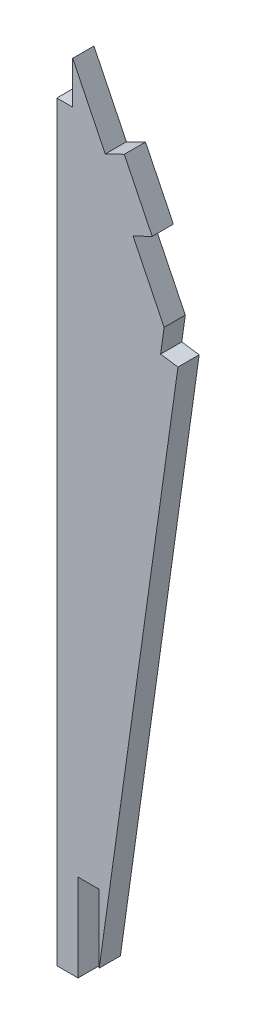
ISO-10303-21;
HEADER;
FILE_DESCRIPTION(('STEP AP214'),'2;1');
FILE_NAME('part.step','',(''),(''),'','','');
FILE_SCHEMA(('AUTOMOTIVE_DESIGN { 1 0 10303 214 1 1 1 1 }'));
ENDSEC;
DATA;
#1=APPLICATION_CONTEXT('core data for automotive mechanical design processes');
#2=APPLICATION_PROTOCOL_DEFINITION('international standard','automotive_design',2000,#1);
#3=PRODUCT_CONTEXT('',#1,'mechanical');
#4=PRODUCT('Part','Part','',(#3));
#5=PRODUCT_RELATED_PRODUCT_CATEGORY('part','',(#4));
#6=PRODUCT_DEFINITION_FORMATION('','',#4);
#7=PRODUCT_DEFINITION_CONTEXT('part definition',#1,'design');
#8=PRODUCT_DEFINITION('design','',#6,#7);
#9=PRODUCT_DEFINITION_SHAPE('','',#8);
#10=(LENGTH_UNIT() NAMED_UNIT(*) SI_UNIT(.MILLI.,.METRE.));
#11=(NAMED_UNIT(*) PLANE_ANGLE_UNIT() SI_UNIT($,.RADIAN.));
#12=(NAMED_UNIT(*) SI_UNIT($,.STERADIAN.) SOLID_ANGLE_UNIT());
#13=UNCERTAINTY_MEASURE_WITH_UNIT(LENGTH_MEASURE(1.E-05),#10,'distance_accuracy_value','');
#14=(GEOMETRIC_REPRESENTATION_CONTEXT(3) GLOBAL_UNCERTAINTY_ASSIGNED_CONTEXT((#13)) GLOBAL_UNIT_ASSIGNED_CONTEXT((#10,
#11,#12)) REPRESENTATION_CONTEXT('',''));
#15=CARTESIAN_POINT('',(0.,0.,0.));
#16=DIRECTION('',(0.,0.,1.));
#17=DIRECTION('',(1.,0.,0.));
#18=AXIS2_PLACEMENT_3D('',#15,#16,#17);
#19=CARTESIAN_POINT('',(6.17305665492677,80.7430384671234,2.));
#20=DIRECTION('',(-0.898794046299136,-0.43837114678914,0.));
#21=DIRECTION('',(0.43837114678914,-0.898794046299136,0.));
#22=AXIS2_PLACEMENT_3D('',#19,#20,#21);
#23=PLANE('',#22);
#24=DIRECTION('',(-0.43837114678914,0.898794046299136,0.));
#25=VECTOR('',#24,1.);
#26=CARTESIAN_POINT('',(6.17305665492677,80.7430384671234,0.));
#27=LINE('',#26,#25);
#28=CARTESIAN_POINT('',(9.24165468245155,74.4514801430278,0.));
#29=VERTEX_POINT('',#28);
#30=CARTESIAN_POINT('',(6.17305665492677,80.7430384671234,0.));
#31=VERTEX_POINT('',#30);
#32=EDGE_CURVE('E174',#29,#31,#27,.T.);
#33=ORIENTED_EDGE('',*,*,#32,.T.);
#34=DIRECTION('',(0.,0.,-1.));
#35=VECTOR('',#34,1.);
#36=CARTESIAN_POINT('',(6.17305665492677,80.7430384671234,2.));
#37=LINE('',#36,#35);
#38=CARTESIAN_POINT('',(6.17305665492677,80.7430384671234,2.));
#39=VERTEX_POINT('',#38);
#40=EDGE_CURVE('E11',#39,#31,#37,.T.);
#41=ORIENTED_EDGE('',*,*,#40,.F.);
#42=DIRECTION('',(-0.43837114678914,0.898794046299136,0.));
#43=VECTOR('',#42,1.);
#44=CARTESIAN_POINT('',(6.17305665492677,80.7430384671234,2.));
#45=LINE('',#44,#43);
#46=CARTESIAN_POINT('',(9.24165468245155,74.4514801430278,2.));
#47=VERTEX_POINT('',#46);
#48=EDGE_CURVE('E202',#47,#39,#45,.T.);
#49=ORIENTED_EDGE('',*,*,#48,.F.);
#50=DIRECTION('',(0.,0.,-1.));
#51=VECTOR('',#50,1.);
#52=CARTESIAN_POINT('',(9.24165468245155,74.4514801430278,2.));
#53=LINE('',#52,#51);
#54=EDGE_CURVE('E170',#47,#29,#53,.T.);
#55=ORIENTED_EDGE('',*,*,#54,.T.);
#56=EDGE_LOOP('',(#33,#41,#49,#55));
#57=FACE_BOUND('',#56,.T.);
#58=ADVANCED_FACE('F36',(#57),#23,.F.);
#59=CARTESIAN_POINT('',(6.17305665492677,80.7430384671234,2.));
#60=DIRECTION('',(1.,2.27465615787485E-13,0.));
#61=DIRECTION('',(-2.27465615787485E-13,1.,0.));
#62=AXIS2_PLACEMENT_3D('',#59,#60,#61);
#63=PLANE('',#62);
#64=DIRECTION('',(2.27465615787485E-13,-1.,0.));
#65=VECTOR('',#64,1.);
#66=CARTESIAN_POINT('',(6.17305665492677,80.7430384671234,0.));
#67=LINE('',#66,#65);
#68=CARTESIAN_POINT('',(6.17305665492768,76.7430384671238,0.));
#69=VERTEX_POINT('',#68);
#70=EDGE_CURVE('E177',#31,#69,#67,.T.);
#71=ORIENTED_EDGE('',*,*,#70,.T.);
#72=DIRECTION('',(0.,0.,-1.));
#73=VECTOR('',#72,1.);
#74=CARTESIAN_POINT('',(6.17305665492768,76.7430384671238,2.));
#75=LINE('',#74,#73);
#76=CARTESIAN_POINT('',(6.17305665492768,76.7430384671238,2.));
#77=VERTEX_POINT('',#76);
#78=EDGE_CURVE('E44',#77,#69,#75,.T.);
#79=ORIENTED_EDGE('',*,*,#78,.F.);
#80=DIRECTION('',(2.27465615787485E-13,-1.,0.));
#81=VECTOR('',#80,1.);
#82=CARTESIAN_POINT('',(6.17305665492677,80.7430384671234,2.));
#83=LINE('',#82,#81);
#84=EDGE_CURVE('E116',#39,#77,#83,.T.);
#85=ORIENTED_EDGE('',*,*,#84,.F.);
#86=ORIENTED_EDGE('',*,*,#40,.T.);
#87=EDGE_LOOP('',(#71,#79,#85,#86));
#88=FACE_BOUND('',#87,.T.);
#89=ADVANCED_FACE('F295',(#88),#63,.F.);
#90=CARTESIAN_POINT('',(6.17305665492768,76.7430384671238,2.));
#91=DIRECTION('',(0.,-1.,0.));
#92=DIRECTION('',(0.,0.,-1.));
#93=AXIS2_PLACEMENT_3D('',#90,#91,#92);
#94=PLANE('',#93);
#95=DIRECTION('',(-1.,0.,0.));
#96=VECTOR('',#95,1.);
#97=CARTESIAN_POINT('',(6.17305665492768,76.7430384671238,0.));
#98=LINE('',#97,#96);
#99=CARTESIAN_POINT('',(4.67305665492768,76.7430384671238,0.));
#100=VERTEX_POINT('',#99);
#101=EDGE_CURVE('E179',#69,#100,#98,.T.);
#102=ORIENTED_EDGE('',*,*,#101,.T.);
#103=DIRECTION('',(0.,0.,-1.));
#104=VECTOR('',#103,1.);
#105=CARTESIAN_POINT('',(4.67305665492768,76.7430384671238,2.));
#106=LINE('',#105,#104);
#107=CARTESIAN_POINT('',(4.67305665492768,76.7430384671238,2.));
#108=VERTEX_POINT('',#107);
#109=EDGE_CURVE('E230',#108,#100,#106,.T.);
#110=ORIENTED_EDGE('',*,*,#109,.F.);
#111=DIRECTION('',(-1.,0.,0.));
#112=VECTOR('',#111,1.);
#113=CARTESIAN_POINT('',(6.17305665492768,76.7430384671238,2.));
#114=LINE('',#113,#112);
#115=EDGE_CURVE('E238',#77,#108,#114,.T.);
#116=ORIENTED_EDGE('',*,*,#115,.F.);
#117=ORIENTED_EDGE('',*,*,#78,.T.);
#118=EDGE_LOOP('',(#102,#110,#116,#117));
#119=FACE_BOUND('',#118,.T.);
#120=ADVANCED_FACE('F236',(#119),#94,.F.);
#121=CARTESIAN_POINT('',(4.67305665492768,76.7430384671238,2.));
#122=DIRECTION('',(1.,0.,0.));
#123=DIRECTION('',(0.,1.,0.));
#124=AXIS2_PLACEMENT_3D('',#121,#122,#123);
#125=PLANE('',#124);
#126=DIRECTION('',(0.,-1.,0.));
#127=VECTOR('',#126,1.);
#128=CARTESIAN_POINT('',(4.67305665492768,76.7430384671238,0.));
#129=LINE('',#128,#127);
#130=CARTESIAN_POINT('',(4.67305665492677,5.83506006179459,0.));
#131=VERTEX_POINT('',#130);
#132=EDGE_CURVE('E181',#100,#131,#129,.T.);
#133=ORIENTED_EDGE('',*,*,#132,.T.);
#134=DIRECTION('',(0.,0.,-1.));
#135=VECTOR('',#134,1.);
#136=CARTESIAN_POINT('',(4.67305665492677,5.83506006179459,2.));
#137=LINE('',#136,#135);
#138=CARTESIAN_POINT('',(4.67305665492677,5.83506006179459,2.));
#139=VERTEX_POINT('',#138);
#140=EDGE_CURVE('E227',#139,#131,#137,.T.);
#141=ORIENTED_EDGE('',*,*,#140,.F.);
#142=DIRECTION('',(0.,-1.,0.));
#143=VECTOR('',#142,1.);
#144=CARTESIAN_POINT('',(4.67305665492768,76.7430384671238,2.));
#145=LINE('',#144,#143);
#146=EDGE_CURVE('E256',#108,#139,#145,.T.);
#147=ORIENTED_EDGE('',*,*,#146,.F.);
#148=ORIENTED_EDGE('',*,*,#109,.T.);
#149=EDGE_LOOP('',(#133,#141,#147,#148));
#150=FACE_BOUND('',#149,.T.);
#151=ADVANCED_FACE('F247',(#150),#125,.F.);
#152=CARTESIAN_POINT('',(4.67305665492677,5.83506006179459,2.));
#153=DIRECTION('',(0.,1.,0.));
#154=DIRECTION('',(0.,0.,1.));
#155=AXIS2_PLACEMENT_3D('',#152,#153,#154);
#156=PLANE('',#155);
#157=DIRECTION('',(1.,0.,0.));
#158=VECTOR('',#157,1.);
#159=CARTESIAN_POINT('',(4.67305665492677,5.83506006179459,0.));
#160=LINE('',#159,#158);
#161=CARTESIAN_POINT('',(6.67305665492677,5.83506006179459,0.));
#162=VERTEX_POINT('',#161);
#163=EDGE_CURVE('E183',#131,#162,#160,.T.);
#164=ORIENTED_EDGE('',*,*,#163,.T.);
#165=DIRECTION('',(0.,0.,-1.));
#166=VECTOR('',#165,1.);
#167=CARTESIAN_POINT('',(6.67305665492677,5.83506006179459,2.));
#168=LINE('',#167,#166);
#169=CARTESIAN_POINT('',(6.67305665492677,5.83506006179459,2.));
#170=VERTEX_POINT('',#169);
#171=EDGE_CURVE('E224',#170,#162,#168,.T.);
#172=ORIENTED_EDGE('',*,*,#171,.F.);
#173=DIRECTION('',(1.,0.,0.));
#174=VECTOR('',#173,1.);
#175=CARTESIAN_POINT('',(4.67305665492677,5.83506006179459,2.));
#176=LINE('',#175,#174);
#177=EDGE_CURVE('E253',#139,#170,#176,.T.);
#178=ORIENTED_EDGE('',*,*,#177,.F.);
#179=ORIENTED_EDGE('',*,*,#140,.T.);
#180=EDGE_LOOP('',(#164,#172,#178,#179));
#181=FACE_BOUND('',#180,.T.);
#182=ADVANCED_FACE('F251',(#181),#156,.F.);
#183=CARTESIAN_POINT('',(6.67305665492677,5.83506006179459,2.));
#184=DIRECTION('',(-1.,0.,0.));
#185=DIRECTION('',(0.,0.,1.));
#186=AXIS2_PLACEMENT_3D('',#183,#184,#185);
#187=PLANE('',#186);
#188=DIRECTION('',(0.,1.,0.));
#189=VECTOR('',#188,1.);
#190=CARTESIAN_POINT('',(6.67305665492677,5.83506006179459,0.));
#191=LINE('',#190,#189);
#192=CARTESIAN_POINT('',(6.67305665492677,14.0850600617946,0.));
#193=VERTEX_POINT('',#192);
#194=EDGE_CURVE('E185',#162,#193,#191,.T.);
#195=ORIENTED_EDGE('',*,*,#194,.T.);
#196=DIRECTION('',(0.,0.,-1.));
#197=VECTOR('',#196,1.);
#198=CARTESIAN_POINT('',(6.67305665492677,14.0850600617946,2.));
#199=LINE('',#198,#197);
#200=CARTESIAN_POINT('',(6.67305665492677,14.0850600617946,2.));
#201=VERTEX_POINT('',#200);
#202=EDGE_CURVE('E221',#201,#193,#199,.T.);
#203=ORIENTED_EDGE('',*,*,#202,.F.);
#204=DIRECTION('',(0.,1.,0.));
#205=VECTOR('',#204,1.);
#206=CARTESIAN_POINT('',(6.67305665492677,5.83506006179459,2.));
#207=LINE('',#206,#205);
#208=EDGE_CURVE('E255',#170,#201,#207,.T.);
#209=ORIENTED_EDGE('',*,*,#208,.F.);
#210=ORIENTED_EDGE('',*,*,#171,.T.);
#211=EDGE_LOOP('',(#195,#203,#209,#210));
#212=FACE_BOUND('',#211,.T.);
#213=ADVANCED_FACE('F308',(#212),#187,.F.);
#214=CARTESIAN_POINT('',(6.67305665492677,14.0850600617946,2.));
#215=DIRECTION('',(0.,1.,0.));
#216=DIRECTION('',(0.,0.,1.));
#217=AXIS2_PLACEMENT_3D('',#214,#215,#216);
#218=PLANE('',#217);
#219=DIRECTION('',(1.,0.,0.));
#220=VECTOR('',#219,1.);
#221=CARTESIAN_POINT('',(6.67305665492677,14.0850600617946,0.));
#222=LINE('',#221,#220);
#223=CARTESIAN_POINT('',(8.67305665492677,14.0850600617946,0.));
#224=VERTEX_POINT('',#223);
#225=EDGE_CURVE('E187',#193,#224,#222,.T.);
#226=ORIENTED_EDGE('',*,*,#225,.T.);
#227=DIRECTION('',(0.,0.,-1.));
#228=VECTOR('',#227,1.);
#229=CARTESIAN_POINT('',(8.67305665492677,14.0850600617946,2.));
#230=LINE('',#229,#228);
#231=CARTESIAN_POINT('',(8.67305665492677,14.0850600617946,2.));
#232=VERTEX_POINT('',#231);
#233=EDGE_CURVE('E218',#232,#224,#230,.T.);
#234=ORIENTED_EDGE('',*,*,#233,.F.);
#235=DIRECTION('',(1.,0.,0.));
#236=VECTOR('',#235,1.);
#237=CARTESIAN_POINT('',(6.67305665492677,14.0850600617946,2.));
#238=LINE('',#237,#236);
#239=EDGE_CURVE('E258',#201,#232,#238,.T.);
#240=ORIENTED_EDGE('',*,*,#239,.F.);
#241=ORIENTED_EDGE('',*,*,#202,.T.);
#242=EDGE_LOOP('',(#226,#234,#240,#241));
#243=FACE_BOUND('',#242,.T.);
#244=ADVANCED_FACE('F311',(#243),#218,.F.);
#245=CARTESIAN_POINT('',(8.67305665492677,14.0850600617946,2.));
#246=DIRECTION('',(1.,0.,0.));
#247=DIRECTION('',(0.,0.,-1.));
#248=AXIS2_PLACEMENT_3D('',#245,#246,#247);
#249=PLANE('',#248);
#250=DIRECTION('',(0.,-1.,0.));
#251=VECTOR('',#250,1.);
#252=CARTESIAN_POINT('',(8.67305665492677,14.0850600617946,0.));
#253=LINE('',#252,#251);
#254=CARTESIAN_POINT('',(8.67305665492677,7.64042759616723,0.));
#255=VERTEX_POINT('',#254);
#256=EDGE_CURVE('E189',#224,#255,#253,.T.);
#257=ORIENTED_EDGE('',*,*,#256,.T.);
#258=DIRECTION('',(0.,0.,-1.));
#259=VECTOR('',#258,1.);
#260=CARTESIAN_POINT('',(8.67305665492677,7.64042759616723,2.));
#261=LINE('',#260,#259);
#262=CARTESIAN_POINT('',(8.67305665492677,7.64042759616723,2.));
#263=VERTEX_POINT('',#262);
#264=EDGE_CURVE('E215',#263,#255,#261,.T.);
#265=ORIENTED_EDGE('',*,*,#264,.F.);
#266=DIRECTION('',(0.,-1.,0.));
#267=VECTOR('',#266,1.);
#268=CARTESIAN_POINT('',(8.67305665492677,14.0850600617946,2.));
#269=LINE('',#268,#267);
#270=EDGE_CURVE('E264',#232,#263,#269,.T.);
#271=ORIENTED_EDGE('',*,*,#270,.F.);
#272=ORIENTED_EDGE('',*,*,#233,.T.);
#273=EDGE_LOOP('',(#257,#265,#271,#272));
#274=FACE_BOUND('',#273,.T.);
#275=ADVANCED_FACE('F315',(#274),#249,.F.);
#276=CARTESIAN_POINT('',(8.67305665492677,7.64042759616723,2.));
#277=DIRECTION('',(-0.990252961763888,0.139280550393255,0.));
#278=DIRECTION('',(-0.139280550393255,-0.990252961763888,0.));
#279=AXIS2_PLACEMENT_3D('',#276,#277,#278);
#280=PLANE('',#279);
#281=DIRECTION('',(0.139280550393255,0.990252961763888,0.));
#282=VECTOR('',#281,1.);
#283=CARTESIAN_POINT('',(8.67305665492677,7.64042759616723,0.));
#284=LINE('',#283,#282);
#285=CARTESIAN_POINT('',(16.104503768187,60.4763224380504,0.));
#286=VERTEX_POINT('',#285);
#287=EDGE_CURVE('E191',#255,#286,#284,.T.);
#288=ORIENTED_EDGE('',*,*,#287,.T.);
#289=DIRECTION('',(0.,0.,-1.));
#290=VECTOR('',#289,1.);
#291=CARTESIAN_POINT('',(16.104503768187,60.4763224380504,2.));
#292=LINE('',#291,#290);
#293=CARTESIAN_POINT('',(16.104503768187,60.4763224380504,2.));
#294=VERTEX_POINT('',#293);
#295=EDGE_CURVE('E212',#294,#286,#292,.T.);
#296=ORIENTED_EDGE('',*,*,#295,.F.);
#297=DIRECTION('',(0.139280550393255,0.990252961763888,0.));
#298=VECTOR('',#297,1.);
#299=CARTESIAN_POINT('',(8.67305665492677,7.64042759616723,2.));
#300=LINE('',#299,#298);
#301=EDGE_CURVE('E266',#263,#294,#300,.T.);
#302=ORIENTED_EDGE('',*,*,#301,.F.);
#303=ORIENTED_EDGE('',*,*,#264,.T.);
#304=EDGE_LOOP('',(#288,#296,#302,#303));
#305=FACE_BOUND('',#304,.T.);
#306=ADVANCED_FACE('F319',(#305),#280,.F.);
#307=CARTESIAN_POINT('',(16.104503768187,60.4763224380504,2.));
#308=DIRECTION('',(-0.139460770441678,-0.99022759682197,0.));
#309=DIRECTION('',(0.99022759682197,-0.139460770441678,0.));
#310=AXIS2_PLACEMENT_3D('',#307,#308,#309);
#311=PLANE('',#310);
#312=DIRECTION('',(-0.99022759682197,0.139460770441678,0.));
#313=VECTOR('',#312,1.);
#314=CARTESIAN_POINT('',(16.104503768187,60.4763224380504,0.));
#315=LINE('',#314,#313);
#316=CARTESIAN_POINT('',(14.4629537900601,60.7075135555297,0.));
#317=VERTEX_POINT('',#316);
#318=EDGE_CURVE('E193',#286,#317,#315,.T.);
#319=ORIENTED_EDGE('',*,*,#318,.T.);
#320=DIRECTION('',(0.,0.,-1.));
#321=VECTOR('',#320,1.);
#322=CARTESIAN_POINT('',(14.4629537900601,60.7075135555297,2.));
#323=LINE('',#322,#321);
#324=CARTESIAN_POINT('',(14.4629537900601,60.7075135555297,2.));
#325=VERTEX_POINT('',#324);
#326=EDGE_CURVE('E209',#325,#317,#323,.T.);
#327=ORIENTED_EDGE('',*,*,#326,.F.);
#328=DIRECTION('',(-0.99022759682197,0.139460770441678,0.));
#329=VECTOR('',#328,1.);
#330=CARTESIAN_POINT('',(16.104503768187,60.4763224380504,2.));
#331=LINE('',#330,#329);
#332=EDGE_CURVE('E268',#294,#325,#331,.T.);
#333=ORIENTED_EDGE('',*,*,#332,.F.);
#334=ORIENTED_EDGE('',*,*,#295,.T.);
#335=EDGE_LOOP('',(#319,#327,#333,#334));
#336=FACE_BOUND('',#335,.T.);
#337=ADVANCED_FACE('F323',(#336),#311,.F.);
#338=CARTESIAN_POINT('',(14.4629537900601,60.7075135555297,2.));
#339=DIRECTION('',(-0.990227596822041,0.139460770441171,0.));
#340=DIRECTION('',(-0.139460770441171,-0.990227596822041,0.));
#341=AXIS2_PLACEMENT_3D('',#338,#339,#340);
#342=PLANE('',#341);
#343=DIRECTION('',(0.139460770441171,0.990227596822041,0.));
#344=VECTOR('',#343,1.);
#345=CARTESIAN_POINT('',(14.4629537900601,60.7075135555297,0.));
#346=LINE('',#345,#344);
#347=CARTESIAN_POINT('',(14.7950283721348,63.0653767333488,0.));
#348=VERTEX_POINT('',#347);
#349=EDGE_CURVE('E195',#317,#348,#346,.T.);
#350=ORIENTED_EDGE('',*,*,#349,.T.);
#351=DIRECTION('',(0.,0.,-1.));
#352=VECTOR('',#351,1.);
#353=CARTESIAN_POINT('',(14.7950283721348,63.0653767333488,2.));
#354=LINE('',#353,#352);
#355=CARTESIAN_POINT('',(14.7950283721348,63.0653767333488,2.));
#356=VERTEX_POINT('',#355);
#357=EDGE_CURVE('E206',#356,#348,#354,.T.);
#358=ORIENTED_EDGE('',*,*,#357,.F.);
#359=DIRECTION('',(0.139460770441171,0.990227596822041,0.));
#360=VECTOR('',#359,1.);
#361=CARTESIAN_POINT('',(14.4629537900601,60.7075135555297,2.));
#362=LINE('',#361,#360);
#363=EDGE_CURVE('E270',#325,#356,#362,.T.);
#364=ORIENTED_EDGE('',*,*,#363,.F.);
#365=ORIENTED_EDGE('',*,*,#326,.T.);
#366=EDGE_LOOP('',(#350,#358,#364,#365));
#367=FACE_BOUND('',#366,.T.);
#368=ADVANCED_FACE('F276',(#367),#342,.F.);
#369=CARTESIAN_POINT('',(11.8718815631864,69.0587158652324,2.));
#370=DIRECTION('',(-0.89879404629907,-0.438371146789276,0.));
#371=DIRECTION('',(0.438371146789276,-0.89879404629907,0.));
#372=AXIS2_PLACEMENT_3D('',#369,#370,#371);
#373=PLANE('',#372);
#374=DIRECTION('',(-0.438371146789276,0.89879404629907,0.));
#375=VECTOR('',#374,1.);
#376=CARTESIAN_POINT('',(11.8718815631864,69.0587158652324,0.));
#377=LINE('',#376,#375);
#378=CARTESIAN_POINT('',(11.8718815631864,69.0587158652324,0.));
#379=VERTEX_POINT('',#378);
#380=EDGE_CURVE('E197',#348,#379,#377,.T.);
#381=ORIENTED_EDGE('',*,*,#380,.T.);
#382=DIRECTION('',(0.,0.,-1.));
#383=VECTOR('',#382,1.);
#384=CARTESIAN_POINT('',(11.8718815631864,69.0587158652324,2.));
#385=LINE('',#384,#383);
#386=CARTESIAN_POINT('',(11.8718815631864,69.0587158652324,2.));
#387=VERTEX_POINT('',#386);
#388=EDGE_CURVE('E165',#387,#379,#385,.T.);
#389=ORIENTED_EDGE('',*,*,#388,.F.);
#390=DIRECTION('',(-0.438371146789276,0.89879404629907,0.));
#391=VECTOR('',#390,1.);
#392=CARTESIAN_POINT('',(11.8718815631864,69.0587158652324,2.));
#393=LINE('',#392,#391);
#394=EDGE_CURVE('E156',#356,#387,#393,.T.);
#395=ORIENTED_EDGE('',*,*,#394,.F.);
#396=ORIENTED_EDGE('',*,*,#357,.T.);
#397=EDGE_LOOP('',(#381,#389,#395,#396));
#398=FACE_BOUND('',#397,.T.);
#399=ADVANCED_FACE('F280',(#398),#373,.F.);
#400=CARTESIAN_POINT('',(13.6694696557852,69.9354581588104,2.));
#401=DIRECTION('',(-0.438371146788926,0.898794046299241,0.));
#402=DIRECTION('',(-0.898794046299241,-0.438371146788927,0.));
#403=AXIS2_PLACEMENT_3D('',#400,#401,#402);
#404=PLANE('',#403);
#405=DIRECTION('',(0.898794046299241,0.438371146788926,0.));
#406=VECTOR('',#405,1.);
#407=CARTESIAN_POINT('',(13.6694696557852,69.9354581588104,0.));
#408=LINE('',#407,#406);
#409=CARTESIAN_POINT('',(13.6694696557852,69.9354581588104,0.));
#410=VERTEX_POINT('',#409);
#411=EDGE_CURVE('E164',#379,#410,#408,.T.);
#412=ORIENTED_EDGE('',*,*,#411,.T.);
#413=DIRECTION('',(0.,0.,-1.));
#414=VECTOR('',#413,1.);
#415=CARTESIAN_POINT('',(13.6694696557852,69.9354581588104,2.));
#416=LINE('',#415,#414);
#417=CARTESIAN_POINT('',(13.6694696557852,69.9354581588104,2.));
#418=VERTEX_POINT('',#417);
#419=EDGE_CURVE('E161',#418,#410,#416,.T.);
#420=ORIENTED_EDGE('',*,*,#419,.F.);
#421=DIRECTION('',(0.898794046299241,0.438371146788926,0.));
#422=VECTOR('',#421,1.);
#423=CARTESIAN_POINT('',(13.6694696557852,69.9354581588104,2.));
#424=LINE('',#423,#422);
#425=EDGE_CURVE('E150',#387,#418,#424,.T.);
#426=ORIENTED_EDGE('',*,*,#425,.F.);
#427=ORIENTED_EDGE('',*,*,#388,.T.);
#428=EDGE_LOOP('',(#412,#420,#426,#427));
#429=FACE_BOUND('',#428,.T.);
#430=ADVANCED_FACE('F162',(#429),#404,.F.);
#431=CARTESIAN_POINT('',(11.0392427750503,75.3282224366058,2.));
#432=DIRECTION('',(-0.89879404629915,-0.438371146789112,0.));
#433=DIRECTION('',(0.438371146789112,-0.89879404629915,0.));
#434=AXIS2_PLACEMENT_3D('',#431,#432,#433);
#435=PLANE('',#434);
#436=DIRECTION('',(-0.438371146789112,0.89879404629915,0.));
#437=VECTOR('',#436,1.);
#438=CARTESIAN_POINT('',(11.0392427750503,75.3282224366058,0.));
#439=LINE('',#438,#437);
#440=CARTESIAN_POINT('',(11.0392427750503,75.3282224366058,0.));
#441=VERTEX_POINT('',#440);
#442=EDGE_CURVE('E102',#410,#441,#439,.T.);
#443=ORIENTED_EDGE('',*,*,#442,.T.);
#444=DIRECTION('',(0.,0.,-1.));
#445=VECTOR('',#444,1.);
#446=CARTESIAN_POINT('',(11.0392427750503,75.3282224366058,2.));
#447=LINE('',#446,#445);
#448=CARTESIAN_POINT('',(11.0392427750503,75.3282224366058,2.));
#449=VERTEX_POINT('',#448);
#450=EDGE_CURVE('E166',#449,#441,#447,.T.);
#451=ORIENTED_EDGE('',*,*,#450,.F.);
#452=DIRECTION('',(-0.438371146789112,0.89879404629915,0.));
#453=VECTOR('',#452,1.);
#454=CARTESIAN_POINT('',(11.0392427750503,75.3282224366058,2.));
#455=LINE('',#454,#453);
#456=EDGE_CURVE('E154',#418,#449,#455,.T.);
#457=ORIENTED_EDGE('',*,*,#456,.F.);
#458=ORIENTED_EDGE('',*,*,#419,.T.);
#459=EDGE_LOOP('',(#443,#451,#457,#458));
#460=FACE_BOUND('',#459,.T.);
#461=ADVANCED_FACE('F168',(#460),#435,.F.);
#462=CARTESIAN_POINT('',(9.24165468245155,74.4514801430278,2.));
#463=DIRECTION('',(0.438371146788926,-0.898794046299241,0.));
#464=DIRECTION('',(0.898794046299241,0.438371146788927,0.));
#465=AXIS2_PLACEMENT_3D('',#462,#463,#464);
#466=PLANE('',#465);
#467=DIRECTION('',(-0.898794046299241,-0.438371146788926,0.));
#468=VECTOR('',#467,1.);
#469=CARTESIAN_POINT('',(9.24165468245155,74.4514801430278,0.));
#470=LINE('',#469,#468);
#471=EDGE_CURVE('E108',#441,#29,#470,.T.);
#472=ORIENTED_EDGE('',*,*,#471,.T.);
#473=ORIENTED_EDGE('',*,*,#54,.F.);
#474=DIRECTION('',(-0.898794046299241,-0.438371146788926,0.));
#475=VECTOR('',#474,1.);
#476=CARTESIAN_POINT('',(9.24165468245155,74.4514801430278,2.));
#477=LINE('',#476,#475);
#478=EDGE_CURVE('E52',#449,#47,#477,.T.);
#479=ORIENTED_EDGE('',*,*,#478,.F.);
#480=ORIENTED_EDGE('',*,*,#450,.T.);
#481=EDGE_LOOP('',(#472,#473,#479,#480));
#482=FACE_BOUND('',#481,.T.);
#483=ADVANCED_FACE('F284',(#482),#466,.F.);
#484=CARTESIAN_POINT('',(0.,0.,2.));
#485=DIRECTION('',(0.,0.,1.));
#486=DIRECTION('',(1.,0.,0.));
#487=AXIS2_PLACEMENT_3D('',#484,#485,#486);
#488=PLANE('',#487);
#489=ORIENTED_EDGE('',*,*,#48,.T.);
#490=ORIENTED_EDGE('',*,*,#84,.T.);
#491=ORIENTED_EDGE('',*,*,#115,.T.);
#492=ORIENTED_EDGE('',*,*,#146,.T.);
#493=ORIENTED_EDGE('',*,*,#177,.T.);
#494=ORIENTED_EDGE('',*,*,#208,.T.);
#495=ORIENTED_EDGE('',*,*,#239,.T.);
#496=ORIENTED_EDGE('',*,*,#270,.T.);
#497=ORIENTED_EDGE('',*,*,#301,.T.);
#498=ORIENTED_EDGE('',*,*,#332,.T.);
#499=ORIENTED_EDGE('',*,*,#363,.T.);
#500=ORIENTED_EDGE('',*,*,#394,.T.);
#501=ORIENTED_EDGE('',*,*,#425,.T.);
#502=ORIENTED_EDGE('',*,*,#456,.T.);
#503=ORIENTED_EDGE('',*,*,#478,.T.);
#504=EDGE_LOOP('',(#489,#490,#491,#492,#493,#494,#495,#496,#497,#498,#499,#500,#501,#502,#503));
#505=FACE_BOUND('',#504,.T.);
#506=ADVANCED_FACE('F152',(#505),#488,.T.);
#507=CARTESIAN_POINT('',(0.,0.,0.));
#508=DIRECTION('',(0.,0.,1.));
#509=DIRECTION('',(1.,0.,0.));
#510=AXIS2_PLACEMENT_3D('',#507,#508,#509);
#511=PLANE('',#510);
#512=ORIENTED_EDGE('',*,*,#32,.F.);
#513=ORIENTED_EDGE('',*,*,#471,.F.);
#514=ORIENTED_EDGE('',*,*,#442,.F.);
#515=ORIENTED_EDGE('',*,*,#411,.F.);
#516=ORIENTED_EDGE('',*,*,#380,.F.);
#517=ORIENTED_EDGE('',*,*,#349,.F.);
#518=ORIENTED_EDGE('',*,*,#318,.F.);
#519=ORIENTED_EDGE('',*,*,#287,.F.);
#520=ORIENTED_EDGE('',*,*,#256,.F.);
#521=ORIENTED_EDGE('',*,*,#225,.F.);
#522=ORIENTED_EDGE('',*,*,#194,.F.);
#523=ORIENTED_EDGE('',*,*,#163,.F.);
#524=ORIENTED_EDGE('',*,*,#132,.F.);
#525=ORIENTED_EDGE('',*,*,#101,.F.);
#526=ORIENTED_EDGE('',*,*,#70,.F.);
#527=EDGE_LOOP('',(#512,#513,#514,#515,#516,#517,#518,#519,#520,#521,#522,#523,#524,#525,#526));
#528=FACE_BOUND('',#527,.T.);
#529=ADVANCED_FACE('F242',(#528),#511,.F.);
#530=CLOSED_SHELL('',(#58,#89,#120,#151,#182,#213,#244,#275,#306,#337,#368,#399,#430,#461,#483,
#506,#529));
#531=MANIFOLD_SOLID_BREP('B2',#530);
#532=ADVANCED_BREP_SHAPE_REPRESENTATION('',(#18,#531),#14);
#533=SHAPE_DEFINITION_REPRESENTATION(#9,#532);
ENDSEC;
END-ISO-10303-21;
